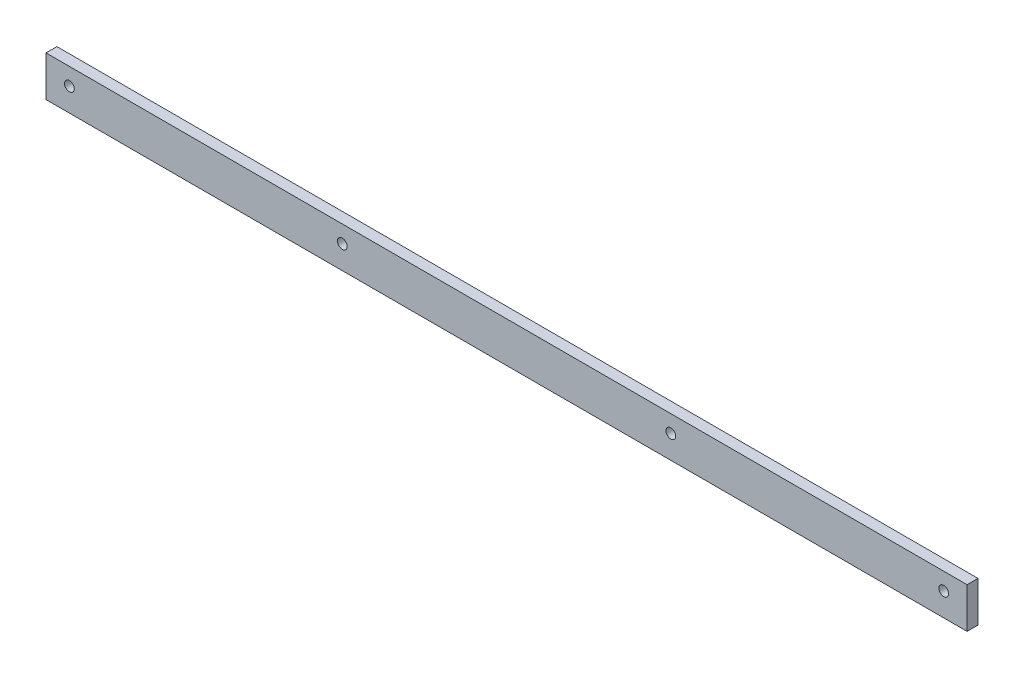
ISO-10303-21;
HEADER;
FILE_DESCRIPTION(('STEP AP214'),'2;1');
FILE_NAME('part.step','',(''),(''),'','','');
FILE_SCHEMA(('AUTOMOTIVE_DESIGN { 1 0 10303 214 1 1 1 1 }'));
ENDSEC;
DATA;
#1=APPLICATION_CONTEXT('core data for automotive mechanical design processes');
#2=APPLICATION_PROTOCOL_DEFINITION('international standard','automotive_design',2000,#1);
#3=PRODUCT_CONTEXT('',#1,'mechanical');
#4=PRODUCT('Part','Part','',(#3));
#5=PRODUCT_RELATED_PRODUCT_CATEGORY('part','',(#4));
#6=PRODUCT_DEFINITION_FORMATION('','',#4);
#7=PRODUCT_DEFINITION_CONTEXT('part definition',#1,'design');
#8=PRODUCT_DEFINITION('design','',#6,#7);
#9=PRODUCT_DEFINITION_SHAPE('','',#8);
#10=(LENGTH_UNIT() NAMED_UNIT(*) SI_UNIT(.MILLI.,.METRE.));
#11=(NAMED_UNIT(*) PLANE_ANGLE_UNIT() SI_UNIT($,.RADIAN.));
#12=(NAMED_UNIT(*) SI_UNIT($,.STERADIAN.) SOLID_ANGLE_UNIT());
#13=UNCERTAINTY_MEASURE_WITH_UNIT(LENGTH_MEASURE(1.E-05),#10,'distance_accuracy_value','');
#14=(GEOMETRIC_REPRESENTATION_CONTEXT(3) GLOBAL_UNCERTAINTY_ASSIGNED_CONTEXT((#13)) GLOBAL_UNIT_ASSIGNED_CONTEXT((#10,
#11,#12)) REPRESENTATION_CONTEXT('',''));
#15=CARTESIAN_POINT('',(0.,0.,0.));
#16=DIRECTION('',(0.,0.,1.));
#17=DIRECTION('',(1.,0.,0.));
#18=AXIS2_PLACEMENT_3D('',#15,#16,#17);
#19=CARTESIAN_POINT('',(134.32,5.9,3.18));
#20=DIRECTION('',(-1.,0.,0.));
#21=DIRECTION('',(0.,0.,1.));
#22=AXIS2_PLACEMENT_3D('',#19,#20,#21);
#23=PLANE('',#22);
#24=DIRECTION('',(0.,1.,0.));
#25=VECTOR('',#24,1.);
#26=CARTESIAN_POINT('',(134.32,5.9,0.));
#27=LINE('',#26,#25);
#28=CARTESIAN_POINT('',(134.32,-5.9,0.));
#29=VERTEX_POINT('',#28);
#30=CARTESIAN_POINT('',(134.32,5.9,0.));
#31=VERTEX_POINT('',#30);
#32=EDGE_CURVE('E107',#29,#31,#27,.T.);
#33=ORIENTED_EDGE('',*,*,#32,.T.);
#34=DIRECTION('',(0.,0.,-1.));
#35=VECTOR('',#34,1.);
#36=CARTESIAN_POINT('',(134.32,5.9,3.18));
#37=LINE('',#36,#35);
#38=CARTESIAN_POINT('',(134.32,5.9,3.18));
#39=VERTEX_POINT('',#38);
#40=EDGE_CURVE('E11',#39,#31,#37,.T.);
#41=ORIENTED_EDGE('',*,*,#40,.F.);
#42=DIRECTION('',(0.,1.,0.));
#43=VECTOR('',#42,1.);
#44=CARTESIAN_POINT('',(134.32,5.9,3.18));
#45=LINE('',#44,#43);
#46=CARTESIAN_POINT('',(134.32,-5.9,3.18));
#47=VERTEX_POINT('',#46);
#48=EDGE_CURVE('E91',#47,#39,#45,.T.);
#49=ORIENTED_EDGE('',*,*,#48,.F.);
#50=DIRECTION('',(0.,0.,-1.));
#51=VECTOR('',#50,1.);
#52=CARTESIAN_POINT('',(134.32,-5.9,3.18));
#53=LINE('',#52,#51);
#54=EDGE_CURVE('E103',#47,#29,#53,.T.);
#55=ORIENTED_EDGE('',*,*,#54,.T.);
#56=EDGE_LOOP('',(#33,#41,#49,#55));
#57=FACE_BOUND('',#56,.T.);
#58=ADVANCED_FACE('F39',(#57),#23,.F.);
#59=CARTESIAN_POINT('',(-134.32,5.9,3.18));
#60=DIRECTION('',(0.,-1.,0.));
#61=DIRECTION('',(0.,0.,-1.));
#62=AXIS2_PLACEMENT_3D('',#59,#60,#61);
#63=PLANE('',#62);
#64=DIRECTION('',(-1.,0.,0.));
#65=VECTOR('',#64,1.);
#66=CARTESIAN_POINT('',(-134.32,5.9,0.));
#67=LINE('',#66,#65);
#68=CARTESIAN_POINT('',(-134.32,5.9,0.));
#69=VERTEX_POINT('',#68);
#70=EDGE_CURVE('E96',#31,#69,#67,.T.);
#71=ORIENTED_EDGE('',*,*,#70,.T.);
#72=DIRECTION('',(0.,0.,-1.));
#73=VECTOR('',#72,1.);
#74=CARTESIAN_POINT('',(-134.32,5.9,3.18));
#75=LINE('',#74,#73);
#76=CARTESIAN_POINT('',(-134.32,5.9,3.18));
#77=VERTEX_POINT('',#76);
#78=EDGE_CURVE('E48',#77,#69,#75,.T.);
#79=ORIENTED_EDGE('',*,*,#78,.F.);
#80=DIRECTION('',(-1.,0.,0.));
#81=VECTOR('',#80,1.);
#82=CARTESIAN_POINT('',(-134.32,5.9,3.18));
#83=LINE('',#82,#81);
#84=EDGE_CURVE('E86',#39,#77,#83,.T.);
#85=ORIENTED_EDGE('',*,*,#84,.F.);
#86=ORIENTED_EDGE('',*,*,#40,.T.);
#87=EDGE_LOOP('',(#71,#79,#85,#86));
#88=FACE_BOUND('',#87,.T.);
#89=ADVANCED_FACE('F95',(#88),#63,.F.);
#90=CARTESIAN_POINT('',(-134.32,5.9,3.18));
#91=DIRECTION('',(1.,0.,0.));
#92=DIRECTION('',(0.,0.,-1.));
#93=AXIS2_PLACEMENT_3D('',#90,#91,#92);
#94=PLANE('',#93);
#95=DIRECTION('',(0.,-1.,0.));
#96=VECTOR('',#95,1.);
#97=CARTESIAN_POINT('',(-134.32,5.9,0.));
#98=LINE('',#97,#96);
#99=CARTESIAN_POINT('',(-134.32,-5.9,0.));
#100=VERTEX_POINT('',#99);
#101=EDGE_CURVE('E73',#69,#100,#98,.T.);
#102=ORIENTED_EDGE('',*,*,#101,.T.);
#103=DIRECTION('',(0.,0.,-1.));
#104=VECTOR('',#103,1.);
#105=CARTESIAN_POINT('',(-134.32,-5.9,3.18));
#106=LINE('',#105,#104);
#107=CARTESIAN_POINT('',(-134.32,-5.9,3.18));
#108=VERTEX_POINT('',#107);
#109=EDGE_CURVE('E98',#108,#100,#106,.T.);
#110=ORIENTED_EDGE('',*,*,#109,.F.);
#111=DIRECTION('',(0.,-1.,0.));
#112=VECTOR('',#111,1.);
#113=CARTESIAN_POINT('',(-134.32,5.9,3.18));
#114=LINE('',#113,#112);
#115=EDGE_CURVE('E89',#77,#108,#114,.T.);
#116=ORIENTED_EDGE('',*,*,#115,.F.);
#117=ORIENTED_EDGE('',*,*,#78,.T.);
#118=EDGE_LOOP('',(#102,#110,#116,#117));
#119=FACE_BOUND('',#118,.T.);
#120=ADVANCED_FACE('F99',(#119),#94,.F.);
#121=CARTESIAN_POINT('',(-134.32,-5.9,3.18));
#122=DIRECTION('',(0.,1.,0.));
#123=DIRECTION('',(0.,0.,1.));
#124=AXIS2_PLACEMENT_3D('',#121,#122,#123);
#125=PLANE('',#124);
#126=DIRECTION('',(1.,0.,0.));
#127=VECTOR('',#126,1.);
#128=CARTESIAN_POINT('',(-134.32,-5.9,0.));
#129=LINE('',#128,#127);
#130=EDGE_CURVE('E79',#100,#29,#129,.T.);
#131=ORIENTED_EDGE('',*,*,#130,.T.);
#132=ORIENTED_EDGE('',*,*,#54,.F.);
#133=DIRECTION('',(1.,0.,0.));
#134=VECTOR('',#133,1.);
#135=CARTESIAN_POINT('',(-134.32,-5.9,3.18));
#136=LINE('',#135,#134);
#137=EDGE_CURVE('E56',#108,#47,#136,.T.);
#138=ORIENTED_EDGE('',*,*,#137,.F.);
#139=ORIENTED_EDGE('',*,*,#109,.T.);
#140=EDGE_LOOP('',(#131,#132,#138,#139));
#141=FACE_BOUND('',#140,.T.);
#142=ADVANCED_FACE('F121',(#141),#125,.F.);
#143=CARTESIAN_POINT('',(0.,0.,3.18));
#144=DIRECTION('',(0.,0.,1.));
#145=DIRECTION('',(1.,0.,0.));
#146=AXIS2_PLACEMENT_3D('',#143,#144,#145);
#147=PLANE('',#146);
#148=CARTESIAN_POINT('',(127.5,0.900000000000002,3.18));
#149=DIRECTION('',(0.,0.,1.));
#150=DIRECTION('',(1.,0.,0.));
#151=AXIS2_PLACEMENT_3D('',#148,#149,#150);
#152=CIRCLE('',#151,1.42500000000002);
#153=CARTESIAN_POINT('',(126.075,0.900000000000002,3.18));
#154=VERTEX_POINT('',#153);
#155=EDGE_CURVE('E111',#154,#154,#152,.T.);
#156=ORIENTED_EDGE('',*,*,#155,.F.);
#157=EDGE_LOOP('',(#156));
#158=FACE_BOUND('',#157,.T.);
#159=CARTESIAN_POINT('',(47.91,0.899999999999992,3.18));
#160=DIRECTION('',(0.,0.,1.));
#161=DIRECTION('',(1.,0.,0.));
#162=AXIS2_PLACEMENT_3D('',#159,#160,#161);
#163=CIRCLE('',#162,1.425);
#164=CARTESIAN_POINT('',(46.485,0.899999999999992,3.18));
#165=VERTEX_POINT('',#164);
#166=EDGE_CURVE('E141',#165,#165,#163,.T.);
#167=ORIENTED_EDGE('',*,*,#166,.F.);
#168=EDGE_LOOP('',(#167));
#169=FACE_BOUND('',#168,.T.);
#170=CARTESIAN_POINT('',(-47.91,0.899999999999925,3.18));
#171=DIRECTION('',(0.,0.,1.));
#172=DIRECTION('',(1.,0.,0.));
#173=AXIS2_PLACEMENT_3D('',#170,#171,#172);
#174=CIRCLE('',#173,1.425);
#175=CARTESIAN_POINT('',(-49.335,0.899999999999925,3.18));
#176=VERTEX_POINT('',#175);
#177=EDGE_CURVE('E132',#176,#176,#174,.T.);
#178=ORIENTED_EDGE('',*,*,#177,.F.);
#179=EDGE_LOOP('',(#178));
#180=FACE_BOUND('',#179,.T.);
#181=CARTESIAN_POINT('',(-127.5,0.899999999999915,3.18));
#182=DIRECTION('',(0.,0.,1.));
#183=DIRECTION('',(1.,0.,0.));
#184=AXIS2_PLACEMENT_3D('',#181,#182,#183);
#185=CIRCLE('',#184,1.42500000000002);
#186=CARTESIAN_POINT('',(-128.925,0.899999999999915,3.18));
#187=VERTEX_POINT('',#186);
#188=EDGE_CURVE('E133',#187,#187,#185,.T.);
#189=ORIENTED_EDGE('',*,*,#188,.F.);
#190=EDGE_LOOP('',(#189));
#191=FACE_BOUND('',#190,.T.);
#192=ORIENTED_EDGE('',*,*,#48,.T.);
#193=ORIENTED_EDGE('',*,*,#84,.T.);
#194=ORIENTED_EDGE('',*,*,#115,.T.);
#195=ORIENTED_EDGE('',*,*,#137,.T.);
#196=EDGE_LOOP('',(#192,#193,#194,#195));
#197=FACE_BOUND('',#196,.T.);
#198=ADVANCED_FACE('F87',(#158,#169,#180,#191,#197),#147,.T.);
#199=CARTESIAN_POINT('',(0.,0.,0.));
#200=DIRECTION('',(0.,0.,1.));
#201=DIRECTION('',(1.,0.,0.));
#202=AXIS2_PLACEMENT_3D('',#199,#200,#201);
#203=PLANE('',#202);
#204=CARTESIAN_POINT('',(127.5,0.900000000000002,0.));
#205=DIRECTION('',(0.,0.,1.));
#206=DIRECTION('',(1.,0.,0.));
#207=AXIS2_PLACEMENT_3D('',#204,#205,#206);
#208=CIRCLE('',#207,1.42500000000002);
#209=CARTESIAN_POINT('',(126.075,0.900000000000002,0.));
#210=VERTEX_POINT('',#209);
#211=EDGE_CURVE('E149',#210,#210,#208,.T.);
#212=ORIENTED_EDGE('',*,*,#211,.T.);
#213=EDGE_LOOP('',(#212));
#214=FACE_BOUND('',#213,.T.);
#215=CARTESIAN_POINT('',(47.91,0.899999999999992,0.));
#216=DIRECTION('',(0.,0.,1.));
#217=DIRECTION('',(1.,0.,0.));
#218=AXIS2_PLACEMENT_3D('',#215,#216,#217);
#219=CIRCLE('',#218,1.425);
#220=CARTESIAN_POINT('',(46.485,0.899999999999992,0.));
#221=VERTEX_POINT('',#220);
#222=EDGE_CURVE('E145',#221,#221,#219,.T.);
#223=ORIENTED_EDGE('',*,*,#222,.T.);
#224=EDGE_LOOP('',(#223));
#225=FACE_BOUND('',#224,.T.);
#226=CARTESIAN_POINT('',(-47.91,0.899999999999925,0.));
#227=DIRECTION('',(0.,0.,1.));
#228=DIRECTION('',(1.,0.,0.));
#229=AXIS2_PLACEMENT_3D('',#226,#227,#228);
#230=CIRCLE('',#229,1.425);
#231=CARTESIAN_POINT('',(-49.335,0.899999999999925,0.));
#232=VERTEX_POINT('',#231);
#233=EDGE_CURVE('E137',#232,#232,#230,.T.);
#234=ORIENTED_EDGE('',*,*,#233,.T.);
#235=EDGE_LOOP('',(#234));
#236=FACE_BOUND('',#235,.T.);
#237=CARTESIAN_POINT('',(-127.5,0.899999999999915,0.));
#238=DIRECTION('',(0.,0.,1.));
#239=DIRECTION('',(1.,0.,0.));
#240=AXIS2_PLACEMENT_3D('',#237,#238,#239);
#241=CIRCLE('',#240,1.42500000000002);
#242=CARTESIAN_POINT('',(-128.925,0.899999999999915,0.));
#243=VERTEX_POINT('',#242);
#244=EDGE_CURVE('E128',#243,#243,#241,.T.);
#245=ORIENTED_EDGE('',*,*,#244,.T.);
#246=EDGE_LOOP('',(#245));
#247=FACE_BOUND('',#246,.T.);
#248=ORIENTED_EDGE('',*,*,#32,.F.);
#249=ORIENTED_EDGE('',*,*,#130,.F.);
#250=ORIENTED_EDGE('',*,*,#101,.F.);
#251=ORIENTED_EDGE('',*,*,#70,.F.);
#252=EDGE_LOOP('',(#248,#249,#250,#251));
#253=FACE_BOUND('',#252,.T.);
#254=ADVANCED_FACE('F124',(#214,#225,#236,#247,#253),#203,.F.);
#255=CARTESIAN_POINT('',(-127.5,0.899999999999915,3.181));
#256=DIRECTION('',(0.,0.,-1.));
#257=DIRECTION('',(-1.,0.,0.));
#258=AXIS2_PLACEMENT_3D('',#255,#256,#257);
#259=CYLINDRICAL_SURFACE('',#258,1.42500000000002);
#260=CARTESIAN_POINT('',(-128.925,0.899999999999915,3.18));
#261=CARTESIAN_POINT('',(-128.925,0.899999999999915,3.146875));
#262=CARTESIAN_POINT('',(-128.925,0.899999999999915,3.11375));
#263=CARTESIAN_POINT('',(-128.925,0.899999999999915,3.0475));
#264=CARTESIAN_POINT('',(-128.925,0.899999999999915,3.014375));
#265=CARTESIAN_POINT('',(-128.925,0.899999999999915,2.948125));
#266=CARTESIAN_POINT('',(-128.925,0.899999999999915,2.915));
#267=CARTESIAN_POINT('',(-128.925,0.899999999999915,2.84875));
#268=CARTESIAN_POINT('',(-128.925,0.899999999999915,2.815625));
#269=CARTESIAN_POINT('',(-128.925,0.899999999999915,2.749375));
#270=CARTESIAN_POINT('',(-128.925,0.899999999999915,2.71625));
#271=CARTESIAN_POINT('',(-128.925,0.899999999999915,2.65));
#272=CARTESIAN_POINT('',(-128.925,0.899999999999915,2.616875));
#273=CARTESIAN_POINT('',(-128.925,0.899999999999915,2.550625));
#274=CARTESIAN_POINT('',(-128.925,0.899999999999915,2.5175));
#275=CARTESIAN_POINT('',(-128.925,0.899999999999915,2.45125));
#276=CARTESIAN_POINT('',(-128.925,0.899999999999915,2.418125));
#277=CARTESIAN_POINT('',(-128.925,0.899999999999915,2.351875));
#278=CARTESIAN_POINT('',(-128.925,0.899999999999915,2.31875));
#279=CARTESIAN_POINT('',(-128.925,0.899999999999915,2.2525));
#280=CARTESIAN_POINT('',(-128.925,0.899999999999915,2.219375));
#281=CARTESIAN_POINT('',(-128.925,0.899999999999915,2.153125));
#282=CARTESIAN_POINT('',(-128.925,0.899999999999915,2.12));
#283=CARTESIAN_POINT('',(-128.925,0.899999999999915,2.05375));
#284=CARTESIAN_POINT('',(-128.925,0.899999999999915,2.020625));
#285=CARTESIAN_POINT('',(-128.925,0.899999999999915,1.954375));
#286=CARTESIAN_POINT('',(-128.925,0.899999999999915,1.92125));
#287=CARTESIAN_POINT('',(-128.925,0.899999999999915,1.855));
#288=CARTESIAN_POINT('',(-128.925,0.899999999999915,1.821875));
#289=CARTESIAN_POINT('',(-128.925,0.899999999999915,1.755625));
#290=CARTESIAN_POINT('',(-128.925,0.899999999999915,1.7225));
#291=CARTESIAN_POINT('',(-128.925,0.899999999999915,1.65625));
#292=CARTESIAN_POINT('',(-128.925,0.899999999999915,1.623125));
#293=CARTESIAN_POINT('',(-128.925,0.899999999999915,1.556875));
#294=CARTESIAN_POINT('',(-128.925,0.899999999999915,1.52375));
#295=CARTESIAN_POINT('',(-128.925,0.899999999999915,1.4575));
#296=CARTESIAN_POINT('',(-128.925,0.899999999999915,1.424375));
#297=CARTESIAN_POINT('',(-128.925,0.899999999999915,1.358125));
#298=CARTESIAN_POINT('',(-128.925,0.899999999999915,1.325));
#299=CARTESIAN_POINT('',(-128.925,0.899999999999915,1.25875));
#300=CARTESIAN_POINT('',(-128.925,0.899999999999915,1.225625));
#301=CARTESIAN_POINT('',(-128.925,0.899999999999915,1.159375));
#302=CARTESIAN_POINT('',(-128.925,0.899999999999915,1.12625));
#303=CARTESIAN_POINT('',(-128.925,0.899999999999915,1.06));
#304=CARTESIAN_POINT('',(-128.925,0.899999999999915,1.026875));
#305=CARTESIAN_POINT('',(-128.925,0.899999999999915,0.960625));
#306=CARTESIAN_POINT('',(-128.925,0.899999999999915,0.9275));
#307=CARTESIAN_POINT('',(-128.925,0.899999999999915,0.86125));
#308=CARTESIAN_POINT('',(-128.925,0.899999999999915,0.828125));
#309=CARTESIAN_POINT('',(-128.925,0.899999999999915,0.761875));
#310=CARTESIAN_POINT('',(-128.925,0.899999999999915,0.72875));
#311=CARTESIAN_POINT('',(-128.925,0.899999999999915,0.6625));
#312=CARTESIAN_POINT('',(-128.925,0.899999999999915,0.629375));
#313=CARTESIAN_POINT('',(-128.925,0.899999999999915,0.563125));
#314=CARTESIAN_POINT('',(-128.925,0.899999999999915,0.53));
#315=CARTESIAN_POINT('',(-128.925,0.899999999999915,0.46375));
#316=CARTESIAN_POINT('',(-128.925,0.899999999999915,0.430625));
#317=CARTESIAN_POINT('',(-128.925,0.899999999999915,0.364375));
#318=CARTESIAN_POINT('',(-128.925,0.899999999999915,0.33125));
#319=CARTESIAN_POINT('',(-128.925,0.899999999999915,0.265));
#320=CARTESIAN_POINT('',(-128.925,0.899999999999915,0.231875));
#321=CARTESIAN_POINT('',(-128.925,0.899999999999915,0.165625));
#322=CARTESIAN_POINT('',(-128.925,0.899999999999915,0.1325));
#323=CARTESIAN_POINT('',(-128.925,0.899999999999915,0.0662499999999998));
#324=CARTESIAN_POINT('',(-128.925,0.899999999999915,0.0331249999999999));
#325=CARTESIAN_POINT('',(-128.925,0.899999999999915,0.));
#326=B_SPLINE_CURVE_WITH_KNOTS('',3,(#260,#261,#262,#263,#264,#265,#266,#267,#268,#269,#270,
#271,#272,#273,#274,#275,#276,#277,#278,#279,#280,#281,#282,#283,#284,#285,#286,#287,#288,#289,
#290,#291,#292,#293,#294,#295,#296,#297,#298,#299,#300,#301,#302,#303,#304,#305,#306,#307,#308,
#309,#310,#311,#312,#313,#314,#315,#316,#317,#318,#319,#320,#321,#322,#323,#324,#325),
.UNSPECIFIED.,.F.,.F.,(4,2,2,2,2,2,2,2,2,2,2,2,2,2,2,2,2,2,2,2,2,2,2,2,2,2,2,2,2,2,2,2,4),(0.,
0.0993750000000001,0.19875,0.298125,0.3975,0.496875,0.59625,0.695625,0.795,0.894375,0.99375,
1.093125,1.1925,1.291875,1.39125,1.490625,1.59,1.689375,1.78875,1.888125,1.9875,2.086875,
2.18625,2.285625,2.385,2.484375,2.58375,2.683125,2.7825,2.881875,2.98125,3.080625,3.18),.UNSPECIFIED.);
#327=EDGE_CURVE('BSEAM186',#187,#243,#326,.T.);
#328=ORIENTED_EDGE('',*,*,#188,.T.);
#329=ORIENTED_EDGE('',*,*,#244,.F.);
#330=ORIENTED_EDGE('',*,*,#327,.T.);
#331=ORIENTED_EDGE('',*,*,#327,.F.);
#332=EDGE_LOOP('',(#328,#330,#329,#331));
#333=FACE_BOUND('',#332,.T.);
#334=ADVANCED_FACE('F186',(#333),#259,.F.);
#335=CARTESIAN_POINT('',(-47.91,0.899999999999925,3.181));
#336=DIRECTION('',(0.,0.,-1.));
#337=DIRECTION('',(-1.,0.,0.));
#338=AXIS2_PLACEMENT_3D('',#335,#336,#337);
#339=CYLINDRICAL_SURFACE('',#338,1.425);
#340=CARTESIAN_POINT('',(-49.335,0.899999999999925,3.18));
#341=CARTESIAN_POINT('',(-49.335,0.899999999999925,3.146875));
#342=CARTESIAN_POINT('',(-49.335,0.899999999999925,3.11375));
#343=CARTESIAN_POINT('',(-49.335,0.899999999999925,3.0475));
#344=CARTESIAN_POINT('',(-49.335,0.899999999999925,3.014375));
#345=CARTESIAN_POINT('',(-49.335,0.899999999999925,2.948125));
#346=CARTESIAN_POINT('',(-49.335,0.899999999999925,2.915));
#347=CARTESIAN_POINT('',(-49.335,0.899999999999925,2.84875));
#348=CARTESIAN_POINT('',(-49.335,0.899999999999925,2.815625));
#349=CARTESIAN_POINT('',(-49.335,0.899999999999925,2.749375));
#350=CARTESIAN_POINT('',(-49.335,0.899999999999925,2.71625));
#351=CARTESIAN_POINT('',(-49.335,0.899999999999925,2.65));
#352=CARTESIAN_POINT('',(-49.335,0.899999999999925,2.616875));
#353=CARTESIAN_POINT('',(-49.335,0.899999999999925,2.550625));
#354=CARTESIAN_POINT('',(-49.335,0.899999999999925,2.5175));
#355=CARTESIAN_POINT('',(-49.335,0.899999999999925,2.45125));
#356=CARTESIAN_POINT('',(-49.335,0.899999999999925,2.418125));
#357=CARTESIAN_POINT('',(-49.335,0.899999999999925,2.351875));
#358=CARTESIAN_POINT('',(-49.335,0.899999999999925,2.31875));
#359=CARTESIAN_POINT('',(-49.335,0.899999999999925,2.2525));
#360=CARTESIAN_POINT('',(-49.335,0.899999999999925,2.219375));
#361=CARTESIAN_POINT('',(-49.335,0.899999999999925,2.153125));
#362=CARTESIAN_POINT('',(-49.335,0.899999999999925,2.12));
#363=CARTESIAN_POINT('',(-49.335,0.899999999999925,2.05375));
#364=CARTESIAN_POINT('',(-49.335,0.899999999999925,2.020625));
#365=CARTESIAN_POINT('',(-49.335,0.899999999999925,1.954375));
#366=CARTESIAN_POINT('',(-49.335,0.899999999999925,1.92125));
#367=CARTESIAN_POINT('',(-49.335,0.899999999999925,1.855));
#368=CARTESIAN_POINT('',(-49.335,0.899999999999925,1.821875));
#369=CARTESIAN_POINT('',(-49.335,0.899999999999925,1.755625));
#370=CARTESIAN_POINT('',(-49.335,0.899999999999925,1.7225));
#371=CARTESIAN_POINT('',(-49.335,0.899999999999925,1.65625));
#372=CARTESIAN_POINT('',(-49.335,0.899999999999925,1.623125));
#373=CARTESIAN_POINT('',(-49.335,0.899999999999925,1.556875));
#374=CARTESIAN_POINT('',(-49.335,0.899999999999925,1.52375));
#375=CARTESIAN_POINT('',(-49.335,0.899999999999925,1.4575));
#376=CARTESIAN_POINT('',(-49.335,0.899999999999925,1.424375));
#377=CARTESIAN_POINT('',(-49.335,0.899999999999925,1.358125));
#378=CARTESIAN_POINT('',(-49.335,0.899999999999925,1.325));
#379=CARTESIAN_POINT('',(-49.335,0.899999999999925,1.25875));
#380=CARTESIAN_POINT('',(-49.335,0.899999999999925,1.225625));
#381=CARTESIAN_POINT('',(-49.335,0.899999999999925,1.159375));
#382=CARTESIAN_POINT('',(-49.335,0.899999999999925,1.12625));
#383=CARTESIAN_POINT('',(-49.335,0.899999999999925,1.06));
#384=CARTESIAN_POINT('',(-49.335,0.899999999999925,1.026875));
#385=CARTESIAN_POINT('',(-49.335,0.899999999999925,0.960625));
#386=CARTESIAN_POINT('',(-49.335,0.899999999999925,0.9275));
#387=CARTESIAN_POINT('',(-49.335,0.899999999999925,0.86125));
#388=CARTESIAN_POINT('',(-49.335,0.899999999999925,0.828125));
#389=CARTESIAN_POINT('',(-49.335,0.899999999999925,0.761875));
#390=CARTESIAN_POINT('',(-49.335,0.899999999999925,0.72875));
#391=CARTESIAN_POINT('',(-49.335,0.899999999999925,0.6625));
#392=CARTESIAN_POINT('',(-49.335,0.899999999999925,0.629375));
#393=CARTESIAN_POINT('',(-49.335,0.899999999999925,0.563125));
#394=CARTESIAN_POINT('',(-49.335,0.899999999999925,0.53));
#395=CARTESIAN_POINT('',(-49.335,0.899999999999925,0.46375));
#396=CARTESIAN_POINT('',(-49.335,0.899999999999925,0.430625));
#397=CARTESIAN_POINT('',(-49.335,0.899999999999925,0.364375));
#398=CARTESIAN_POINT('',(-49.335,0.899999999999925,0.33125));
#399=CARTESIAN_POINT('',(-49.335,0.899999999999925,0.265));
#400=CARTESIAN_POINT('',(-49.335,0.899999999999925,0.231875));
#401=CARTESIAN_POINT('',(-49.335,0.899999999999925,0.165625));
#402=CARTESIAN_POINT('',(-49.335,0.899999999999925,0.1325));
#403=CARTESIAN_POINT('',(-49.335,0.899999999999925,0.0662499999999998));
#404=CARTESIAN_POINT('',(-49.335,0.899999999999925,0.0331249999999999));
#405=CARTESIAN_POINT('',(-49.335,0.899999999999925,0.));
#406=B_SPLINE_CURVE_WITH_KNOTS('',3,(#340,#341,#342,#343,#344,#345,#346,#347,#348,#349,#350,
#351,#352,#353,#354,#355,#356,#357,#358,#359,#360,#361,#362,#363,#364,#365,#366,#367,#368,#369,
#370,#371,#372,#373,#374,#375,#376,#377,#378,#379,#380,#381,#382,#383,#384,#385,#386,#387,#388,
#389,#390,#391,#392,#393,#394,#395,#396,#397,#398,#399,#400,#401,#402,#403,#404,#405),
.UNSPECIFIED.,.F.,.F.,(4,2,2,2,2,2,2,2,2,2,2,2,2,2,2,2,2,2,2,2,2,2,2,2,2,2,2,2,2,2,2,2,4),(0.,
0.0993750000000001,0.19875,0.298125,0.3975,0.496875,0.59625,0.695625,0.795,0.894375,0.99375,
1.093125,1.1925,1.291875,1.39125,1.490625,1.59,1.689375,1.78875,1.888125,1.9875,2.086875,
2.18625,2.285625,2.385,2.484375,2.58375,2.683125,2.7825,2.881875,2.98125,3.080625,3.18),.UNSPECIFIED.);
#407=EDGE_CURVE('BSEAM170',#176,#232,#406,.T.);
#408=ORIENTED_EDGE('',*,*,#177,.T.);
#409=ORIENTED_EDGE('',*,*,#233,.F.);
#410=ORIENTED_EDGE('',*,*,#407,.T.);
#411=ORIENTED_EDGE('',*,*,#407,.F.);
#412=EDGE_LOOP('',(#408,#410,#409,#411));
#413=FACE_BOUND('',#412,.T.);
#414=ADVANCED_FACE('F170',(#413),#339,.F.);
#415=CARTESIAN_POINT('',(47.91,0.899999999999992,3.181));
#416=DIRECTION('',(0.,0.,-1.));
#417=DIRECTION('',(-1.,0.,0.));
#418=AXIS2_PLACEMENT_3D('',#415,#416,#417);
#419=CYLINDRICAL_SURFACE('',#418,1.425);
#420=CARTESIAN_POINT('',(46.485,0.899999999999992,3.18));
#421=CARTESIAN_POINT('',(46.485,0.899999999999992,3.146875));
#422=CARTESIAN_POINT('',(46.485,0.899999999999992,3.11375));
#423=CARTESIAN_POINT('',(46.485,0.899999999999992,3.0475));
#424=CARTESIAN_POINT('',(46.485,0.899999999999992,3.014375));
#425=CARTESIAN_POINT('',(46.485,0.899999999999992,2.948125));
#426=CARTESIAN_POINT('',(46.485,0.899999999999992,2.915));
#427=CARTESIAN_POINT('',(46.485,0.899999999999992,2.84875));
#428=CARTESIAN_POINT('',(46.485,0.899999999999992,2.815625));
#429=CARTESIAN_POINT('',(46.485,0.899999999999992,2.749375));
#430=CARTESIAN_POINT('',(46.485,0.899999999999992,2.71625));
#431=CARTESIAN_POINT('',(46.485,0.899999999999992,2.65));
#432=CARTESIAN_POINT('',(46.485,0.899999999999992,2.616875));
#433=CARTESIAN_POINT('',(46.485,0.899999999999992,2.550625));
#434=CARTESIAN_POINT('',(46.485,0.899999999999992,2.5175));
#435=CARTESIAN_POINT('',(46.485,0.899999999999992,2.45125));
#436=CARTESIAN_POINT('',(46.485,0.899999999999992,2.418125));
#437=CARTESIAN_POINT('',(46.485,0.899999999999992,2.351875));
#438=CARTESIAN_POINT('',(46.485,0.899999999999992,2.31875));
#439=CARTESIAN_POINT('',(46.485,0.899999999999992,2.2525));
#440=CARTESIAN_POINT('',(46.485,0.899999999999992,2.219375));
#441=CARTESIAN_POINT('',(46.485,0.899999999999992,2.153125));
#442=CARTESIAN_POINT('',(46.485,0.899999999999992,2.12));
#443=CARTESIAN_POINT('',(46.485,0.899999999999992,2.05375));
#444=CARTESIAN_POINT('',(46.485,0.899999999999992,2.020625));
#445=CARTESIAN_POINT('',(46.485,0.899999999999992,1.954375));
#446=CARTESIAN_POINT('',(46.485,0.899999999999992,1.92125));
#447=CARTESIAN_POINT('',(46.485,0.899999999999992,1.855));
#448=CARTESIAN_POINT('',(46.485,0.899999999999992,1.821875));
#449=CARTESIAN_POINT('',(46.485,0.899999999999992,1.755625));
#450=CARTESIAN_POINT('',(46.485,0.899999999999992,1.7225));
#451=CARTESIAN_POINT('',(46.485,0.899999999999992,1.65625));
#452=CARTESIAN_POINT('',(46.485,0.899999999999992,1.623125));
#453=CARTESIAN_POINT('',(46.485,0.899999999999992,1.556875));
#454=CARTESIAN_POINT('',(46.485,0.899999999999992,1.52375));
#455=CARTESIAN_POINT('',(46.485,0.899999999999992,1.4575));
#456=CARTESIAN_POINT('',(46.485,0.899999999999992,1.424375));
#457=CARTESIAN_POINT('',(46.485,0.899999999999992,1.358125));
#458=CARTESIAN_POINT('',(46.485,0.899999999999992,1.325));
#459=CARTESIAN_POINT('',(46.485,0.899999999999992,1.25875));
#460=CARTESIAN_POINT('',(46.485,0.899999999999992,1.225625));
#461=CARTESIAN_POINT('',(46.485,0.899999999999992,1.159375));
#462=CARTESIAN_POINT('',(46.485,0.899999999999992,1.12625));
#463=CARTESIAN_POINT('',(46.485,0.899999999999992,1.06));
#464=CARTESIAN_POINT('',(46.485,0.899999999999992,1.026875));
#465=CARTESIAN_POINT('',(46.485,0.899999999999992,0.960625));
#466=CARTESIAN_POINT('',(46.485,0.899999999999992,0.9275));
#467=CARTESIAN_POINT('',(46.485,0.899999999999992,0.86125));
#468=CARTESIAN_POINT('',(46.485,0.899999999999992,0.828125));
#469=CARTESIAN_POINT('',(46.485,0.899999999999992,0.761875));
#470=CARTESIAN_POINT('',(46.485,0.899999999999992,0.72875));
#471=CARTESIAN_POINT('',(46.485,0.899999999999992,0.6625));
#472=CARTESIAN_POINT('',(46.485,0.899999999999992,0.629375));
#473=CARTESIAN_POINT('',(46.485,0.899999999999992,0.563125));
#474=CARTESIAN_POINT('',(46.485,0.899999999999992,0.53));
#475=CARTESIAN_POINT('',(46.485,0.899999999999992,0.46375));
#476=CARTESIAN_POINT('',(46.485,0.899999999999992,0.430625));
#477=CARTESIAN_POINT('',(46.485,0.899999999999992,0.364375));
#478=CARTESIAN_POINT('',(46.485,0.899999999999992,0.33125));
#479=CARTESIAN_POINT('',(46.485,0.899999999999992,0.265));
#480=CARTESIAN_POINT('',(46.485,0.899999999999992,0.231875));
#481=CARTESIAN_POINT('',(46.485,0.899999999999992,0.165625));
#482=CARTESIAN_POINT('',(46.485,0.899999999999992,0.1325));
#483=CARTESIAN_POINT('',(46.485,0.899999999999992,0.0662499999999998));
#484=CARTESIAN_POINT('',(46.485,0.899999999999992,0.0331249999999999));
#485=CARTESIAN_POINT('',(46.485,0.899999999999992,0.));
#486=B_SPLINE_CURVE_WITH_KNOTS('',3,(#420,#421,#422,#423,#424,#425,#426,#427,#428,#429,#430,
#431,#432,#433,#434,#435,#436,#437,#438,#439,#440,#441,#442,#443,#444,#445,#446,#447,#448,#449,
#450,#451,#452,#453,#454,#455,#456,#457,#458,#459,#460,#461,#462,#463,#464,#465,#466,#467,#468,
#469,#470,#471,#472,#473,#474,#475,#476,#477,#478,#479,#480,#481,#482,#483,#484,#485),
.UNSPECIFIED.,.F.,.F.,(4,2,2,2,2,2,2,2,2,2,2,2,2,2,2,2,2,2,2,2,2,2,2,2,2,2,2,2,2,2,2,2,4),(0.,
0.0993750000000001,0.19875,0.298125,0.3975,0.496875,0.59625,0.695625,0.795,0.894375,0.99375,
1.093125,1.1925,1.291875,1.39125,1.490625,1.59,1.689375,1.78875,1.888125,1.9875,2.086875,
2.18625,2.285625,2.385,2.484375,2.58375,2.683125,2.7825,2.881875,2.98125,3.080625,3.18),.UNSPECIFIED.);
#487=EDGE_CURVE('BSEAM164',#165,#221,#486,.T.);
#488=ORIENTED_EDGE('',*,*,#166,.T.);
#489=ORIENTED_EDGE('',*,*,#222,.F.);
#490=ORIENTED_EDGE('',*,*,#487,.T.);
#491=ORIENTED_EDGE('',*,*,#487,.F.);
#492=EDGE_LOOP('',(#488,#490,#489,#491));
#493=FACE_BOUND('',#492,.T.);
#494=ADVANCED_FACE('F164',(#493),#419,.F.);
#495=CARTESIAN_POINT('',(127.5,0.900000000000002,3.181));
#496=DIRECTION('',(0.,0.,-1.));
#497=DIRECTION('',(-1.,0.,0.));
#498=AXIS2_PLACEMENT_3D('',#495,#496,#497);
#499=CYLINDRICAL_SURFACE('',#498,1.42500000000002);
#500=CARTESIAN_POINT('',(126.075,0.900000000000002,3.18));
#501=CARTESIAN_POINT('',(126.075,0.900000000000002,3.146875));
#502=CARTESIAN_POINT('',(126.075,0.900000000000002,3.11375));
#503=CARTESIAN_POINT('',(126.075,0.900000000000002,3.0475));
#504=CARTESIAN_POINT('',(126.075,0.900000000000002,3.014375));
#505=CARTESIAN_POINT('',(126.075,0.900000000000002,2.948125));
#506=CARTESIAN_POINT('',(126.075,0.900000000000002,2.915));
#507=CARTESIAN_POINT('',(126.075,0.900000000000002,2.84875));
#508=CARTESIAN_POINT('',(126.075,0.900000000000002,2.815625));
#509=CARTESIAN_POINT('',(126.075,0.900000000000002,2.749375));
#510=CARTESIAN_POINT('',(126.075,0.900000000000002,2.71625));
#511=CARTESIAN_POINT('',(126.075,0.900000000000002,2.65));
#512=CARTESIAN_POINT('',(126.075,0.900000000000002,2.616875));
#513=CARTESIAN_POINT('',(126.075,0.900000000000002,2.550625));
#514=CARTESIAN_POINT('',(126.075,0.900000000000002,2.5175));
#515=CARTESIAN_POINT('',(126.075,0.900000000000002,2.45125));
#516=CARTESIAN_POINT('',(126.075,0.900000000000002,2.418125));
#517=CARTESIAN_POINT('',(126.075,0.900000000000002,2.351875));
#518=CARTESIAN_POINT('',(126.075,0.900000000000002,2.31875));
#519=CARTESIAN_POINT('',(126.075,0.900000000000002,2.2525));
#520=CARTESIAN_POINT('',(126.075,0.900000000000002,2.219375));
#521=CARTESIAN_POINT('',(126.075,0.900000000000002,2.153125));
#522=CARTESIAN_POINT('',(126.075,0.900000000000002,2.12));
#523=CARTESIAN_POINT('',(126.075,0.900000000000002,2.05375));
#524=CARTESIAN_POINT('',(126.075,0.900000000000002,2.020625));
#525=CARTESIAN_POINT('',(126.075,0.900000000000002,1.954375));
#526=CARTESIAN_POINT('',(126.075,0.900000000000002,1.92125));
#527=CARTESIAN_POINT('',(126.075,0.900000000000002,1.855));
#528=CARTESIAN_POINT('',(126.075,0.900000000000002,1.821875));
#529=CARTESIAN_POINT('',(126.075,0.900000000000002,1.755625));
#530=CARTESIAN_POINT('',(126.075,0.900000000000002,1.7225));
#531=CARTESIAN_POINT('',(126.075,0.900000000000002,1.65625));
#532=CARTESIAN_POINT('',(126.075,0.900000000000002,1.623125));
#533=CARTESIAN_POINT('',(126.075,0.900000000000002,1.556875));
#534=CARTESIAN_POINT('',(126.075,0.900000000000002,1.52375));
#535=CARTESIAN_POINT('',(126.075,0.900000000000002,1.4575));
#536=CARTESIAN_POINT('',(126.075,0.900000000000002,1.424375));
#537=CARTESIAN_POINT('',(126.075,0.900000000000002,1.358125));
#538=CARTESIAN_POINT('',(126.075,0.900000000000002,1.325));
#539=CARTESIAN_POINT('',(126.075,0.900000000000002,1.25875));
#540=CARTESIAN_POINT('',(126.075,0.900000000000002,1.225625));
#541=CARTESIAN_POINT('',(126.075,0.900000000000002,1.159375));
#542=CARTESIAN_POINT('',(126.075,0.900000000000002,1.12625));
#543=CARTESIAN_POINT('',(126.075,0.900000000000002,1.06));
#544=CARTESIAN_POINT('',(126.075,0.900000000000002,1.026875));
#545=CARTESIAN_POINT('',(126.075,0.900000000000002,0.960625));
#546=CARTESIAN_POINT('',(126.075,0.900000000000002,0.9275));
#547=CARTESIAN_POINT('',(126.075,0.900000000000002,0.86125));
#548=CARTESIAN_POINT('',(126.075,0.900000000000002,0.828125));
#549=CARTESIAN_POINT('',(126.075,0.900000000000002,0.761875));
#550=CARTESIAN_POINT('',(126.075,0.900000000000002,0.72875));
#551=CARTESIAN_POINT('',(126.075,0.900000000000002,0.6625));
#552=CARTESIAN_POINT('',(126.075,0.900000000000002,0.629375));
#553=CARTESIAN_POINT('',(126.075,0.900000000000002,0.563125));
#554=CARTESIAN_POINT('',(126.075,0.900000000000002,0.53));
#555=CARTESIAN_POINT('',(126.075,0.900000000000002,0.46375));
#556=CARTESIAN_POINT('',(126.075,0.900000000000002,0.430625));
#557=CARTESIAN_POINT('',(126.075,0.900000000000002,0.364375));
#558=CARTESIAN_POINT('',(126.075,0.900000000000002,0.33125));
#559=CARTESIAN_POINT('',(126.075,0.900000000000002,0.265));
#560=CARTESIAN_POINT('',(126.075,0.900000000000002,0.231875));
#561=CARTESIAN_POINT('',(126.075,0.900000000000002,0.165625));
#562=CARTESIAN_POINT('',(126.075,0.900000000000002,0.1325));
#563=CARTESIAN_POINT('',(126.075,0.900000000000002,0.0662499999999998));
#564=CARTESIAN_POINT('',(126.075,0.900000000000002,0.0331249999999999));
#565=CARTESIAN_POINT('',(126.075,0.900000000000002,0.));
#566=B_SPLINE_CURVE_WITH_KNOTS('',3,(#500,#501,#502,#503,#504,#505,#506,#507,#508,#509,#510,
#511,#512,#513,#514,#515,#516,#517,#518,#519,#520,#521,#522,#523,#524,#525,#526,#527,#528,#529,
#530,#531,#532,#533,#534,#535,#536,#537,#538,#539,#540,#541,#542,#543,#544,#545,#546,#547,#548,
#549,#550,#551,#552,#553,#554,#555,#556,#557,#558,#559,#560,#561,#562,#563,#564,#565),
.UNSPECIFIED.,.F.,.F.,(4,2,2,2,2,2,2,2,2,2,2,2,2,2,2,2,2,2,2,2,2,2,2,2,2,2,2,2,2,2,2,2,4),(0.,
0.0993750000000001,0.19875,0.298125,0.3975,0.496875,0.59625,0.695625,0.795,0.894375,0.99375,
1.093125,1.1925,1.291875,1.39125,1.490625,1.59,1.689375,1.78875,1.888125,1.9875,2.086875,
2.18625,2.285625,2.385,2.484375,2.58375,2.683125,2.7825,2.881875,2.98125,3.080625,3.18),.UNSPECIFIED.);
#567=EDGE_CURVE('BSEAM162',#154,#210,#566,.T.);
#568=ORIENTED_EDGE('',*,*,#155,.T.);
#569=ORIENTED_EDGE('',*,*,#211,.F.);
#570=ORIENTED_EDGE('',*,*,#567,.T.);
#571=ORIENTED_EDGE('',*,*,#567,.F.);
#572=EDGE_LOOP('',(#568,#570,#569,#571));
#573=FACE_BOUND('',#572,.T.);
#574=ADVANCED_FACE('F162',(#573),#499,.F.);
#575=CLOSED_SHELL('',(#58,#89,#120,#142,#198,#254,#334,#414,#494,#574));
#576=MANIFOLD_SOLID_BREP('B2',#575);
#577=ADVANCED_BREP_SHAPE_REPRESENTATION('',(#18,#576),#14);
#578=SHAPE_DEFINITION_REPRESENTATION(#9,#577);
ENDSEC;
END-ISO-10303-21;
